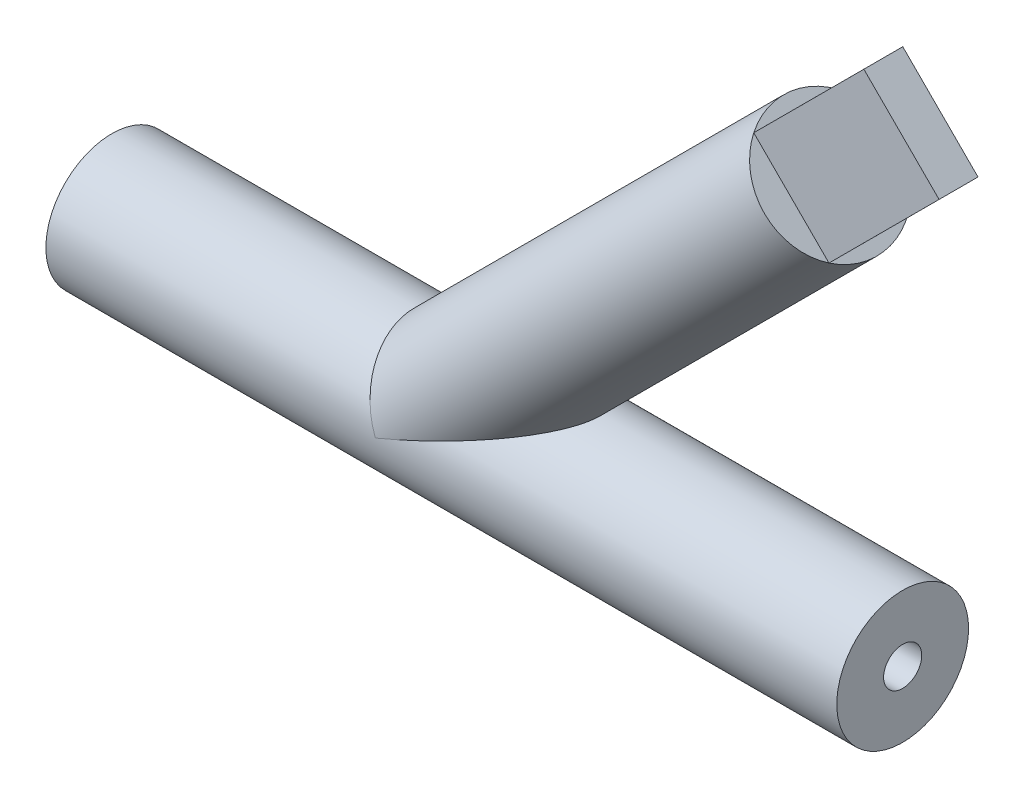
ISO-10303-21;
HEADER;
FILE_DESCRIPTION(('STEP AP214'),'2;1');
FILE_NAME('part.step','',(''),(''),'','','');
FILE_SCHEMA(('AUTOMOTIVE_DESIGN { 1 0 10303 214 1 1 1 1 }'));
ENDSEC;
DATA;
#1=APPLICATION_CONTEXT('core data for automotive mechanical design processes');
#2=APPLICATION_PROTOCOL_DEFINITION('international standard','automotive_design',2000,#1);
#3=PRODUCT_CONTEXT('',#1,'mechanical');
#4=PRODUCT('Part','Part','',(#3));
#5=PRODUCT_RELATED_PRODUCT_CATEGORY('part','',(#4));
#6=PRODUCT_DEFINITION_FORMATION('','',#4);
#7=PRODUCT_DEFINITION_CONTEXT('part definition',#1,'design');
#8=PRODUCT_DEFINITION('design','',#6,#7);
#9=PRODUCT_DEFINITION_SHAPE('','',#8);
#10=(LENGTH_UNIT() NAMED_UNIT(*) SI_UNIT(.MILLI.,.METRE.));
#11=(NAMED_UNIT(*) PLANE_ANGLE_UNIT() SI_UNIT($,.RADIAN.));
#12=(NAMED_UNIT(*) SI_UNIT($,.STERADIAN.) SOLID_ANGLE_UNIT());
#13=UNCERTAINTY_MEASURE_WITH_UNIT(LENGTH_MEASURE(1.E-05),#10,'distance_accuracy_value','');
#14=(GEOMETRIC_REPRESENTATION_CONTEXT(3) GLOBAL_UNCERTAINTY_ASSIGNED_CONTEXT((#13)) GLOBAL_UNIT_ASSIGNED_CONTEXT((#10,
#11,#12)) REPRESENTATION_CONTEXT('',''));
#15=CARTESIAN_POINT('',(0.,0.,0.));
#16=DIRECTION('',(0.,0.,1.));
#17=DIRECTION('',(1.,0.,0.));
#18=AXIS2_PLACEMENT_3D('',#15,#16,#17);
#19=CARTESIAN_POINT('',(138.453318805774,74.9533188057739,0.));
#20=DIRECTION('',(0.707106781186549,0.707106781186546,0.));
#21=DIRECTION('',(-0.707106781186546,0.707106781186549,0.));
#22=AXIS2_PLACEMENT_3D('',#19,#20,#21);
#23=PLANE('',#22);
#24=DIRECTION('',(-0.707106781186547,0.707106781186549,0.));
#25=VECTOR('',#24,1.);
#26=CARTESIAN_POINT('',(106.703318805774,106.703318805774,0.));
#27=LINE('',#26,#25);
#28=CARTESIAN_POINT('',(145.701163312936,67.7054742986119,0.));
#29=VERTEX_POINT('',#28);
#30=CARTESIAN_POINT('',(131.205474298612,82.2011633129361,0.));
#31=VERTEX_POINT('',#30);
#32=EDGE_CURVE('E53',#29,#31,#27,.T.);
#33=ORIENTED_EDGE('',*,*,#32,.F.);
#34=DIRECTION('',(0.,0.,1.));
#35=VECTOR('',#34,1.);
#36=CARTESIAN_POINT('',(145.701163312936,67.7054742986119,-1.65262775797028E-13));
#37=LINE('',#36,#35);
#38=CARTESIAN_POINT('',(145.701163312936,67.7054742986118,7.49849984997));
#39=VERTEX_POINT('',#38);
#40=EDGE_CURVE('E113',#29,#39,#37,.T.);
#41=ORIENTED_EDGE('',*,*,#40,.T.);
#42=CARTESIAN_POINT('',(138.453318805774,74.9533188057739,0.));
#43=DIRECTION('',(0.707106781186549,0.707106781186546,0.));
#44=DIRECTION('',(-0.707106781186546,0.707106781186549,0.));
#45=AXIS2_PLACEMENT_3D('',#42,#43,#44);
#46=CIRCLE('',#45,12.7);
#47=CARTESIAN_POINT('',(131.205474298612,82.2011633129361,7.49849984997));
#48=VERTEX_POINT('',#47);
#49=EDGE_CURVE('E116',#39,#48,#46,.T.);
#50=ORIENTED_EDGE('',*,*,#49,.T.);
#51=DIRECTION('',(0.,0.,1.));
#52=VECTOR('',#51,1.);
#53=CARTESIAN_POINT('',(131.205474298612,82.2011633129361,0.));
#54=LINE('',#53,#52);
#55=EDGE_CURVE('E58',#31,#48,#54,.T.);
#56=ORIENTED_EDGE('',*,*,#55,.F.);
#57=EDGE_LOOP('',(#33,#41,#50,#56));
#58=FACE_BOUND('',#57,.T.);
#59=ADVANCED_FACE('F36',(#58),#23,.T.);
#60=CARTESIAN_POINT('',(152.4,0.,0.));
#61=DIRECTION('',(-1.,0.,0.));
#62=DIRECTION('',(0.,0.,1.));
#63=AXIS2_PLACEMENT_3D('',#60,#61,#62);
#64=CYLINDRICAL_SURFACE('',#63,12.7);
#65=CARTESIAN_POINT('',(0.,0.,0.));
#66=DIRECTION('',(1.,0.,0.));
#67=DIRECTION('',(0.,0.,-1.));
#68=AXIS2_PLACEMENT_3D('',#65,#66,#67);
#69=CIRCLE('',#68,12.7);
#70=CARTESIAN_POINT('',(0.,0.,-12.7));
#71=VERTEX_POINT('',#70);
#72=EDGE_CURVE('E129',#71,#71,#69,.T.);
#73=ORIENTED_EDGE('',*,*,#72,.T.);
#74=EDGE_LOOP('',(#73));
#75=FACE_BOUND('',#74,.T.);
#76=CARTESIAN_POINT('',(152.4,0.,0.));
#77=DIRECTION('',(1.,0.,0.));
#78=DIRECTION('',(0.,0.,-1.));
#79=AXIS2_PLACEMENT_3D('',#76,#77,#78);
#80=CIRCLE('',#79,12.7);
#81=CARTESIAN_POINT('',(152.4,0.,-12.7));
#82=VERTEX_POINT('',#81);
#83=EDGE_CURVE('E126',#82,#82,#80,.T.);
#84=ORIENTED_EDGE('',*,*,#83,.F.);
#85=EDGE_LOOP('',(#84));
#86=FACE_BOUND('',#85,.T.);
#87=CARTESIAN_POINT('',(63.5,0.,0.));
#88=DIRECTION('',(-0.923879532511287,-0.382683432365089,0.));
#89=DIRECTION('',(-0.382683432365089,0.923879532511287,0.));
#90=AXIS2_PLACEMENT_3D('',#87,#88,#89);
#91=ELLIPSE('',#90,13.7463809437134,12.7);
#92=CARTESIAN_POINT('',(63.5,0.,-12.7));
#93=VERTEX_POINT('',#92);
#94=CARTESIAN_POINT('',(63.5,0.,12.7));
#95=VERTEX_POINT('',#94);
#96=EDGE_CURVE('E11',#93,#95,#91,.F.);
#97=ORIENTED_EDGE('',*,*,#96,.F.);
#98=CARTESIAN_POINT('',(63.5,0.,0.));
#99=DIRECTION('',(-0.382683432365089,0.923879532511287,0.));
#100=DIRECTION('',(-0.923879532511287,-0.382683432365089,0.));
#101=AXIS2_PLACEMENT_3D('',#98,#99,#100);
#102=ELLIPSE('',#101,33.18669930786,12.7);
#103=EDGE_CURVE('E45',#95,#93,#102,.T.);
#104=ORIENTED_EDGE('',*,*,#103,.F.);
#105=EDGE_LOOP('',(#97,#104));
#106=FACE_BOUND('',#105,.T.);
#107=ADVANCED_FACE('F38',(#75,#86,#106),#64,.T.);
#108=CARTESIAN_POINT('',(152.4,0.,0.));
#109=DIRECTION('',(1.,0.,0.));
#110=DIRECTION('',(0.,0.,-1.));
#111=AXIS2_PLACEMENT_3D('',#108,#109,#110);
#112=PLANE('',#111);
#113=CARTESIAN_POINT('',(152.4,0.,0.));
#114=DIRECTION('',(-1.,0.,0.));
#115=DIRECTION('',(0.,0.,1.));
#116=AXIS2_PLACEMENT_3D('',#113,#114,#115);
#117=CIRCLE('',#116,3.675);
#118=CARTESIAN_POINT('',(152.4,0.,3.675));
#119=VERTEX_POINT('',#118);
#120=EDGE_CURVE('E204',#119,#119,#117,.T.);
#121=ORIENTED_EDGE('',*,*,#120,.T.);
#122=EDGE_LOOP('',(#121));
#123=FACE_BOUND('',#122,.T.);
#124=ORIENTED_EDGE('',*,*,#83,.T.);
#125=EDGE_LOOP('',(#124));
#126=FACE_BOUND('',#125,.T.);
#127=ADVANCED_FACE('F183',(#123,#126),#112,.T.);
#128=CARTESIAN_POINT('',(0.,0.,0.));
#129=DIRECTION('',(1.,0.,0.));
#130=DIRECTION('',(0.,0.,-1.));
#131=AXIS2_PLACEMENT_3D('',#128,#129,#130);
#132=PLANE('',#131);
#133=CARTESIAN_POINT('',(0.,0.,0.));
#134=DIRECTION('',(-1.,0.,0.));
#135=DIRECTION('',(0.,0.,1.));
#136=AXIS2_PLACEMENT_3D('',#133,#134,#135);
#137=CIRCLE('',#136,3.675);
#138=CARTESIAN_POINT('',(0.,0.,3.675));
#139=VERTEX_POINT('',#138);
#140=EDGE_CURVE('E202',#139,#139,#137,.T.);
#141=ORIENTED_EDGE('',*,*,#140,.F.);
#142=EDGE_LOOP('',(#141));
#143=FACE_BOUND('',#142,.T.);
#144=ORIENTED_EDGE('',*,*,#72,.F.);
#145=EDGE_LOOP('',(#144));
#146=FACE_BOUND('',#145,.T.);
#147=ADVANCED_FACE('F177',(#143,#146),#132,.F.);
#148=CARTESIAN_POINT('',(138.453318805774,74.9533188057739,0.));
#149=DIRECTION('',(-0.707106781186549,-0.707106781186546,0.));
#150=DIRECTION('',(0.707106781186546,-0.707106781186549,0.));
#151=AXIS2_PLACEMENT_3D('',#148,#149,#150);
#152=CYLINDRICAL_SURFACE('',#151,12.7);
#153=CARTESIAN_POINT('',(131.206250432977,82.2003871785713,7.50000000000001));
#154=VERTEX_POINT('',#153);
#155=CARTESIAN_POINT('',(145.700387178572,67.7062504329765,7.50000000000001));
#156=VERTEX_POINT('',#155);
#157=EDGE_CURVE('E118',#154,#156,#46,.T.);
#158=ORIENTED_EDGE('',*,*,#157,.F.);
#159=DIRECTION('',(-0.707106781186549,-0.707106781186546,0.));
#160=VECTOR('',#159,1.);
#161=CARTESIAN_POINT('',(152.419453868573,103.413590614168,7.5));
#162=LINE('',#161,#160);
#163=CARTESIAN_POINT('',(152.419453868573,103.413590614168,7.5));
#164=VERTEX_POINT('',#163);
#165=EDGE_CURVE('E120',#164,#154,#162,.T.);
#166=ORIENTED_EDGE('',*,*,#165,.F.);
#167=CARTESIAN_POINT('',(159.666522241371,96.1665222413704,0.));
#168=DIRECTION('',(0.707106781186549,0.707106781186547,0.));
#169=DIRECTION('',(-0.707106781186547,0.707106781186549,0.));
#170=AXIS2_PLACEMENT_3D('',#167,#168,#169);
#171=CIRCLE('',#170,12.7);
#172=CARTESIAN_POINT('',(152.418677734209,103.414366748533,7.49849984997));
#173=VERTEX_POINT('',#172);
#174=EDGE_CURVE('E104',#173,#164,#171,.T.);
#175=ORIENTED_EDGE('',*,*,#174,.F.);
#176=DIRECTION('',(-0.707106781186549,-0.707106781186546,0.));
#177=VECTOR('',#176,1.);
#178=CARTESIAN_POINT('',(152.418677734209,103.414366748533,7.49849984997));
#179=LINE('',#178,#177);
#180=EDGE_CURVE('E101',#173,#48,#179,.T.);
#181=ORIENTED_EDGE('',*,*,#180,.T.);
#182=ORIENTED_EDGE('',*,*,#49,.F.);
#183=DIRECTION('',(-0.707106781186549,-0.707106781186546,0.));
#184=VECTOR('',#183,1.);
#185=CARTESIAN_POINT('',(166.914366748533,88.9186777342082,7.49849984997));
#186=LINE('',#185,#184);
#187=CARTESIAN_POINT('',(166.914366748533,88.9186777342082,7.49849984997));
#188=VERTEX_POINT('',#187);
#189=EDGE_CURVE('E154',#188,#39,#186,.T.);
#190=ORIENTED_EDGE('',*,*,#189,.F.);
#191=CARTESIAN_POINT('',(166.913590614168,88.919453868573,7.5));
#192=VERTEX_POINT('',#191);
#193=EDGE_CURVE('E210',#192,#188,#171,.T.);
#194=ORIENTED_EDGE('',*,*,#193,.F.);
#195=DIRECTION('',(-0.707106781186549,-0.707106781186546,0.));
#196=VECTOR('',#195,1.);
#197=CARTESIAN_POINT('',(166.913590614168,88.919453868573,7.5));
#198=LINE('',#197,#196);
#199=EDGE_CURVE('E151',#192,#156,#198,.T.);
#200=ORIENTED_EDGE('',*,*,#199,.T.);
#201=EDGE_LOOP('',(#158,#166,#175,#181,#182,#190,#194,#200));
#202=FACE_BOUND('',#201,.T.);
#203=ORIENTED_EDGE('',*,*,#103,.T.);
#204=ORIENTED_EDGE('',*,*,#96,.T.);
#205=EDGE_LOOP('',(#203,#204));
#206=FACE_BOUND('',#205,.T.);
#207=ADVANCED_FACE('F165',(#202,#206),#152,.T.);
#208=DIRECTION('',(0.707106781186547,-0.707106781186549,0.));
#209=VECTOR('',#208,1.);
#210=CARTESIAN_POINT('',(106.703318805774,106.703318805774,7.50000000000001));
#211=LINE('',#210,#209);
#212=EDGE_CURVE('E139',#154,#156,#211,.T.);
#213=ORIENTED_EDGE('',*,*,#212,.F.);
#214=ORIENTED_EDGE('',*,*,#157,.T.);
#215=EDGE_LOOP('',(#213,#214));
#216=FACE_BOUND('',#215,.T.);
#217=ADVANCED_FACE('F169',(#216),#23,.T.);
#218=CARTESIAN_POINT('',(127.916522241371,127.91652224137,0.));
#219=DIRECTION('',(0.,0.,1.));
#220=DIRECTION('',(0.,-1.,0.));
#221=AXIS2_PLACEMENT_3D('',#218,#219,#220);
#222=PLANE('',#221);
#223=ORIENTED_EDGE('',*,*,#32,.T.);
#224=DIRECTION('',(-0.707106781186549,-0.707106781186546,0.));
#225=VECTOR('',#224,1.);
#226=CARTESIAN_POINT('',(152.418677734209,103.414366748533,0.));
#227=LINE('',#226,#225);
#228=CARTESIAN_POINT('',(152.418677734209,103.414366748533,0.));
#229=VERTEX_POINT('',#228);
#230=EDGE_CURVE('E99',#229,#31,#227,.T.);
#231=ORIENTED_EDGE('',*,*,#230,.F.);
#232=DIRECTION('',(-0.707106781186547,0.707106781186549,0.));
#233=VECTOR('',#232,1.);
#234=CARTESIAN_POINT('',(127.916522241371,127.91652224137,0.));
#235=LINE('',#234,#233);
#236=CARTESIAN_POINT('',(166.914366748533,88.9186777342083,0.));
#237=VERTEX_POINT('',#236);
#238=EDGE_CURVE('E105',#237,#229,#235,.T.);
#239=ORIENTED_EDGE('',*,*,#238,.F.);
#240=DIRECTION('',(-0.707106781186549,-0.707106781186546,0.));
#241=VECTOR('',#240,1.);
#242=CARTESIAN_POINT('',(166.914366748533,88.9186777342083,0.));
#243=LINE('',#242,#241);
#244=EDGE_CURVE('E124',#237,#29,#243,.T.);
#245=ORIENTED_EDGE('',*,*,#244,.T.);
#246=EDGE_LOOP('',(#223,#231,#239,#245));
#247=FACE_BOUND('',#246,.T.);
#248=ADVANCED_FACE('F115',(#247),#222,.F.);
#249=CARTESIAN_POINT('',(152.418677734209,103.414366748533,0.));
#250=DIRECTION('',(0.707106781186546,-0.707106781186549,0.));
#251=DIRECTION('',(0.707106781186549,0.707106781186546,0.));
#252=AXIS2_PLACEMENT_3D('',#249,#250,#251);
#253=PLANE('',#252);
#254=ORIENTED_EDGE('',*,*,#55,.T.);
#255=ORIENTED_EDGE('',*,*,#180,.F.);
#256=DIRECTION('',(0.,0.,1.));
#257=VECTOR('',#256,1.);
#258=CARTESIAN_POINT('',(152.418677734209,103.414366748533,0.));
#259=LINE('',#258,#257);
#260=EDGE_CURVE('E95',#229,#173,#259,.T.);
#261=ORIENTED_EDGE('',*,*,#260,.F.);
#262=ORIENTED_EDGE('',*,*,#230,.T.);
#263=EDGE_LOOP('',(#254,#255,#261,#262));
#264=FACE_BOUND('',#263,.T.);
#265=ADVANCED_FACE('F97',(#264),#253,.F.);
#266=CARTESIAN_POINT('',(127.916522241371,127.91652224137,7.50000000000001));
#267=DIRECTION('',(0.,0.,-1.));
#268=DIRECTION('',(0.,1.,0.));
#269=AXIS2_PLACEMENT_3D('',#266,#267,#268);
#270=PLANE('',#269);
#271=ORIENTED_EDGE('',*,*,#212,.T.);
#272=ORIENTED_EDGE('',*,*,#199,.F.);
#273=DIRECTION('',(0.707106781186547,-0.707106781186549,0.));
#274=VECTOR('',#273,1.);
#275=CARTESIAN_POINT('',(127.916522241371,127.91652224137,7.50000000000001));
#276=LINE('',#275,#274);
#277=EDGE_CURVE('E162',#164,#192,#276,.T.);
#278=ORIENTED_EDGE('',*,*,#277,.F.);
#279=ORIENTED_EDGE('',*,*,#165,.T.);
#280=EDGE_LOOP('',(#271,#272,#278,#279));
#281=FACE_BOUND('',#280,.T.);
#282=ADVANCED_FACE('F160',(#281),#270,.F.);
#283=CARTESIAN_POINT('',(166.914366748533,88.9186777342083,-1.65262775797028E-13));
#284=DIRECTION('',(0.707106781186546,-0.707106781186549,0.));
#285=DIRECTION('',(0.707106781186549,0.707106781186546,0.));
#286=AXIS2_PLACEMENT_3D('',#283,#284,#285);
#287=PLANE('',#286);
#288=ORIENTED_EDGE('',*,*,#40,.F.);
#289=ORIENTED_EDGE('',*,*,#244,.F.);
#290=DIRECTION('',(0.,0.,1.));
#291=VECTOR('',#290,1.);
#292=CARTESIAN_POINT('',(166.914366748533,88.9186777342083,-1.65262775797028E-13));
#293=LINE('',#292,#291);
#294=EDGE_CURVE('E111',#237,#188,#293,.T.);
#295=ORIENTED_EDGE('',*,*,#294,.T.);
#296=ORIENTED_EDGE('',*,*,#189,.T.);
#297=EDGE_LOOP('',(#288,#289,#295,#296));
#298=FACE_BOUND('',#297,.T.);
#299=ADVANCED_FACE('F220',(#298),#287,.T.);
#300=CARTESIAN_POINT('',(127.916522241371,127.91652224137,0.));
#301=DIRECTION('',(0.707106781186549,0.707106781186547,0.));
#302=DIRECTION('',(-0.707106781186547,0.707106781186549,0.));
#303=AXIS2_PLACEMENT_3D('',#300,#301,#302);
#304=PLANE('',#303);
#305=ORIENTED_EDGE('',*,*,#238,.T.);
#306=ORIENTED_EDGE('',*,*,#260,.T.);
#307=ORIENTED_EDGE('',*,*,#174,.T.);
#308=ORIENTED_EDGE('',*,*,#277,.T.);
#309=ORIENTED_EDGE('',*,*,#193,.T.);
#310=ORIENTED_EDGE('',*,*,#294,.F.);
#311=EDGE_LOOP('',(#305,#306,#307,#308,#309,#310));
#312=FACE_BOUND('',#311,.T.);
#313=ADVANCED_FACE('F109',(#312),#304,.T.);
#314=CARTESIAN_POINT('',(152.4,0.,0.));
#315=DIRECTION('',(-1.,0.,0.));
#316=DIRECTION('',(0.,0.,1.));
#317=AXIS2_PLACEMENT_3D('',#314,#315,#316);
#318=CYLINDRICAL_SURFACE('',#317,3.675);
#319=CARTESIAN_POINT('',(152.4,0.,3.675));
#320=CARTESIAN_POINT('',(150.8125,0.,3.675));
#321=CARTESIAN_POINT('',(149.225,0.,3.675));
#322=CARTESIAN_POINT('',(146.05,0.,3.675));
#323=CARTESIAN_POINT('',(144.4625,0.,3.675));
#324=CARTESIAN_POINT('',(141.2875,0.,3.675));
#325=CARTESIAN_POINT('',(139.7,0.,3.675));
#326=CARTESIAN_POINT('',(136.525,0.,3.675));
#327=CARTESIAN_POINT('',(134.9375,0.,3.675));
#328=CARTESIAN_POINT('',(131.7625,0.,3.675));
#329=CARTESIAN_POINT('',(130.175,0.,3.675));
#330=CARTESIAN_POINT('',(127.,0.,3.675));
#331=CARTESIAN_POINT('',(125.4125,0.,3.675));
#332=CARTESIAN_POINT('',(122.2375,0.,3.675));
#333=CARTESIAN_POINT('',(120.65,0.,3.675));
#334=CARTESIAN_POINT('',(117.475,0.,3.675));
#335=CARTESIAN_POINT('',(115.8875,0.,3.675));
#336=CARTESIAN_POINT('',(112.7125,0.,3.675));
#337=CARTESIAN_POINT('',(111.125,0.,3.675));
#338=CARTESIAN_POINT('',(107.95,0.,3.675));
#339=CARTESIAN_POINT('',(106.3625,0.,3.675));
#340=CARTESIAN_POINT('',(103.1875,0.,3.675));
#341=CARTESIAN_POINT('',(101.6,0.,3.675));
#342=CARTESIAN_POINT('',(98.425,0.,3.675));
#343=CARTESIAN_POINT('',(96.8375,0.,3.675));
#344=CARTESIAN_POINT('',(93.6625,0.,3.675));
#345=CARTESIAN_POINT('',(92.075,0.,3.675));
#346=CARTESIAN_POINT('',(88.9,0.,3.675));
#347=CARTESIAN_POINT('',(87.3125,0.,3.675));
#348=CARTESIAN_POINT('',(84.1375,0.,3.675));
#349=CARTESIAN_POINT('',(82.55,0.,3.675));
#350=CARTESIAN_POINT('',(79.375,0.,3.675));
#351=CARTESIAN_POINT('',(77.7875,0.,3.675));
#352=CARTESIAN_POINT('',(74.6125,0.,3.675));
#353=CARTESIAN_POINT('',(73.025,0.,3.675));
#354=CARTESIAN_POINT('',(69.85,0.,3.675));
#355=CARTESIAN_POINT('',(68.2625,0.,3.675));
#356=CARTESIAN_POINT('',(65.0875,0.,3.675));
#357=CARTESIAN_POINT('',(63.5,0.,3.675));
#358=CARTESIAN_POINT('',(60.325,0.,3.675));
#359=CARTESIAN_POINT('',(58.7375,0.,3.675));
#360=CARTESIAN_POINT('',(55.5625,0.,3.675));
#361=CARTESIAN_POINT('',(53.975,0.,3.675));
#362=CARTESIAN_POINT('',(50.8,0.,3.675));
#363=CARTESIAN_POINT('',(49.2125,0.,3.675));
#364=CARTESIAN_POINT('',(46.0375,0.,3.675));
#365=CARTESIAN_POINT('',(44.45,0.,3.675));
#366=CARTESIAN_POINT('',(41.275,0.,3.675));
#367=CARTESIAN_POINT('',(39.6875,0.,3.675));
#368=CARTESIAN_POINT('',(36.5125,0.,3.675));
#369=CARTESIAN_POINT('',(34.925,0.,3.675));
#370=CARTESIAN_POINT('',(31.75,0.,3.675));
#371=CARTESIAN_POINT('',(30.1625,0.,3.675));
#372=CARTESIAN_POINT('',(26.9875,0.,3.675));
#373=CARTESIAN_POINT('',(25.4,0.,3.675));
#374=CARTESIAN_POINT('',(22.225,0.,3.675));
#375=CARTESIAN_POINT('',(20.6375,0.,3.675));
#376=CARTESIAN_POINT('',(17.4625,0.,3.675));
#377=CARTESIAN_POINT('',(15.875,0.,3.675));
#378=CARTESIAN_POINT('',(12.7,0.,3.675));
#379=CARTESIAN_POINT('',(11.1125,0.,3.675));
#380=CARTESIAN_POINT('',(7.93750000000001,0.,3.675));
#381=CARTESIAN_POINT('',(6.35,0.,3.675));
#382=CARTESIAN_POINT('',(3.175,0.,3.675));
#383=CARTESIAN_POINT('',(1.5875,0.,3.675));
#384=CARTESIAN_POINT('',(0.,0.,3.675));
#385=B_SPLINE_CURVE_WITH_KNOTS('',3,(#319,#320,#321,#322,#323,#324,#325,#326,#327,#328,#329,
#330,#331,#332,#333,#334,#335,#336,#337,#338,#339,#340,#341,#342,#343,#344,#345,#346,#347,#348,
#349,#350,#351,#352,#353,#354,#355,#356,#357,#358,#359,#360,#361,#362,#363,#364,#365,#366,#367,
#368,#369,#370,#371,#372,#373,#374,#375,#376,#377,#378,#379,#380,#381,#382,#383,#384),
.UNSPECIFIED.,.F.,.F.,(4,2,2,2,2,2,2,2,2,2,2,2,2,2,2,2,2,2,2,2,2,2,2,2,2,2,2,2,2,2,2,2,4),(0.,
4.7625,9.52500000000001,14.2875,19.05,23.8125,28.575,33.3375,38.1,42.8625,47.625,52.3875,57.15,
61.9125,66.675,71.4375,76.2,80.9625,85.725,90.4875,95.25,100.0125,104.775,109.5375,114.3,
119.0625,123.825,128.5875,133.35,138.1125,142.875,147.6375,152.4),.UNSPECIFIED.);
#386=EDGE_CURVE('BSEAM227',#119,#139,#385,.T.);
#387=ORIENTED_EDGE('',*,*,#120,.F.);
#388=ORIENTED_EDGE('',*,*,#140,.T.);
#389=ORIENTED_EDGE('',*,*,#386,.T.);
#390=ORIENTED_EDGE('',*,*,#386,.F.);
#391=EDGE_LOOP('',(#387,#389,#388,#390));
#392=FACE_BOUND('',#391,.T.);
#393=ADVANCED_FACE('F227',(#392),#318,.F.);
#394=CLOSED_SHELL('',(#59,#107,#127,#147,#207,#217,#248,#265,#282,#299,#313,#393));
#395=MANIFOLD_SOLID_BREP('B2',#394);
#396=ADVANCED_BREP_SHAPE_REPRESENTATION('',(#18,#395),#14);
#397=SHAPE_DEFINITION_REPRESENTATION(#9,#396);
ENDSEC;
END-ISO-10303-21;
